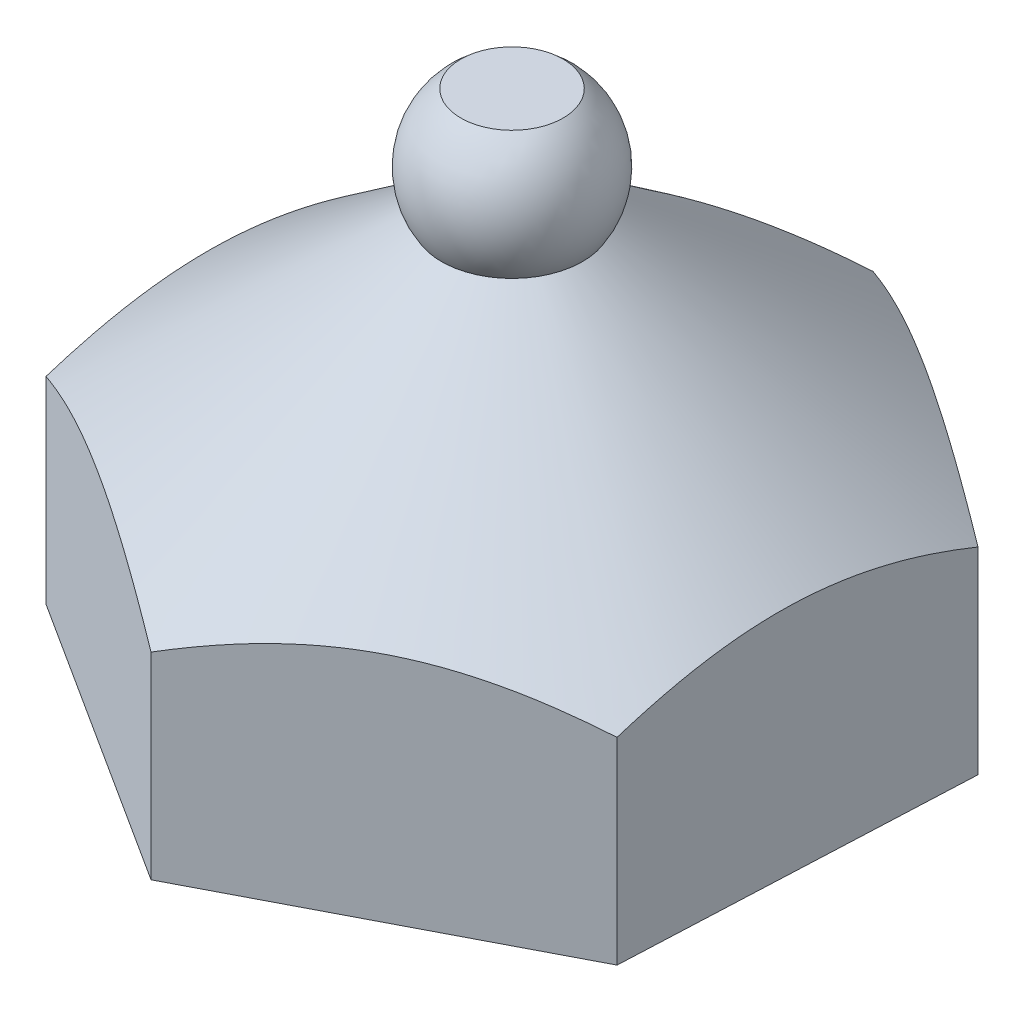
ISO-10303-21;
HEADER;
FILE_DESCRIPTION(('STEP AP214'),'2;1');
FILE_NAME('part.step','',(''),(''),'','','');
FILE_SCHEMA(('AUTOMOTIVE_DESIGN { 1 0 10303 214 1 1 1 1 }'));
ENDSEC;
DATA;
#1=APPLICATION_CONTEXT('core data for automotive mechanical design processes');
#2=APPLICATION_PROTOCOL_DEFINITION('international standard','automotive_design',2000,#1);
#3=PRODUCT_CONTEXT('',#1,'mechanical');
#4=PRODUCT('Part','Part','',(#3));
#5=PRODUCT_RELATED_PRODUCT_CATEGORY('part','',(#4));
#6=PRODUCT_DEFINITION_FORMATION('','',#4);
#7=PRODUCT_DEFINITION_CONTEXT('part definition',#1,'design');
#8=PRODUCT_DEFINITION('design','',#6,#7);
#9=PRODUCT_DEFINITION_SHAPE('','',#8);
#10=(LENGTH_UNIT() NAMED_UNIT(*) SI_UNIT(.MILLI.,.METRE.));
#11=(NAMED_UNIT(*) PLANE_ANGLE_UNIT() SI_UNIT($,.RADIAN.));
#12=(NAMED_UNIT(*) SI_UNIT($,.STERADIAN.) SOLID_ANGLE_UNIT());
#13=UNCERTAINTY_MEASURE_WITH_UNIT(LENGTH_MEASURE(1.E-05),#10,'distance_accuracy_value','');
#14=(GEOMETRIC_REPRESENTATION_CONTEXT(3) GLOBAL_UNCERTAINTY_ASSIGNED_CONTEXT((#13)) GLOBAL_UNIT_ASSIGNED_CONTEXT((#10,
#11,#12)) REPRESENTATION_CONTEXT('',''));
#15=CARTESIAN_POINT('',(0.,0.,0.));
#16=DIRECTION('',(0.,0.,1.));
#17=DIRECTION('',(1.,0.,0.));
#18=AXIS2_PLACEMENT_3D('',#15,#16,#17);
#19=CARTESIAN_POINT('',(0.,51.1495004086117,0.));
#20=DIRECTION('',(0.,-1.,0.));
#21=DIRECTION('',(1.,0.,0.));
#22=AXIS2_PLACEMENT_3D('',#19,#20,#21);
#23=CONICAL_SURFACE('',#22,7.16037048369406,0.921945158520944);
#24=CARTESIAN_POINT('',(0.,51.1495004086117,0.));
#25=DIRECTION('',(0.,1.,0.));
#26=DIRECTION('',(-1.,0.,0.));
#27=AXIS2_PLACEMENT_3D('',#24,#25,#26);
#28=CIRCLE('',#27,7.16037048369406);
#29=CARTESIAN_POINT('',(-7.16037048369406,51.1495004086117,0.));
#30=VERTEX_POINT('',#29);
#31=EDGE_CURVE('E302',#30,#30,#28,.T.);
#32=ORIENTED_EDGE('',*,*,#31,.F.);
#33=EDGE_LOOP('',(#32));
#34=FACE_BOUND('',#33,.T.);
#35=CARTESIAN_POINT('',(1.58385366244929,29.9999145693291,-35.0119251757061));
#36=CARTESIAN_POINT('',(1.01537716760496,30.2427167814775,-34.7171269933952));
#37=CARTESIAN_POINT('',(0.443914783763107,30.4768628882811,-34.4207804011552));
#38=CARTESIAN_POINT('',(-0.705264800507123,30.9254923805729,-33.8248436198386));
#39=CARTESIAN_POINT('',(-1.28298404109508,31.1399691226313,-33.5252523727845));
#40=CARTESIAN_POINT('',(-2.446339868959,31.5473597098329,-32.9219641338767));
#41=CARTESIAN_POINT('',(-3.03199515825695,31.7402061651367,-32.6182574436061));
#42=CARTESIAN_POINT('',(-4.20930541908518,32.1009203685606,-32.0077327727432));
#43=CARTESIAN_POINT('',(-4.80095982843211,32.2687904345519,-31.7009150836856));
#44=CARTESIAN_POINT('',(-5.98429112206433,32.5754364911181,-31.08726805061));
#45=CARTESIAN_POINT('',(-6.57591435867293,32.714473811026,-30.7804665269817));
#46=CARTESIAN_POINT('',(-7.76407653811296,32.9629489971312,-30.1643143131854));
#47=CARTESIAN_POINT('',(-8.36061554822249,33.0723864575242,-29.8549635881286));
#48=CARTESIAN_POINT('',(-9.55692242627263,33.2593444929095,-29.2345877303162));
#49=CARTESIAN_POINT('',(-10.1566855968336,33.3369029640056,-28.9235650335083));
#50=CARTESIAN_POINT('',(-11.3588907297725,33.4585855617172,-28.3001304831453));
#51=CARTESIAN_POINT('',(-11.9613326671131,33.5027100001689,-27.9877186425739));
#52=CARTESIAN_POINT('',(-13.176006628547,33.5568766863673,-27.3578180588582));
#53=CARTESIAN_POINT('',(-13.7882561513357,33.5664258567427,-27.0403202413129));
#54=CARTESIAN_POINT('',(-15.0123744915989,33.5498368172297,-26.405522030805));
#55=CARTESIAN_POINT('',(-15.6242433064035,33.5236983598387,-26.0882216392267));
#56=CARTESIAN_POINT('',(-16.8463190536261,33.4363498253804,-25.4544826681438));
#57=CARTESIAN_POINT('',(-17.4565249261411,33.3751210581077,-25.1380446382792));
#58=CARTESIAN_POINT('',(-18.6735111871933,33.2190137836656,-24.5069449518202));
#59=CARTESIAN_POINT('',(-19.2802915647791,33.124135168978,-24.192283300905));
#60=CARTESIAN_POINT('',(-20.4891111047535,32.9028158684595,-23.565418678782));
#61=CARTESIAN_POINT('',(-21.0911514986381,32.7763836798071,-23.2532150689502));
#62=CARTESIAN_POINT('',(-22.2897882186717,32.4944256033619,-22.6316310113476));
#63=CARTESIAN_POINT('',(-22.8863844261892,32.3388990831691,-22.3222506250963));
#64=CARTESIAN_POINT('',(-24.6668394171144,31.8327875840299,-21.39894966231));
#65=CARTESIAN_POINT('',(-25.8419583932941,31.4425570290747,-20.7895613387493));
#66=CARTESIAN_POINT('',(-27.4288570959712,30.8523093709209,-19.9666339929338));
#67=CARTESIAN_POINT('',(-27.851786194475,30.6887458846854,-19.7473131755983));
#68=CARTESIAN_POINT('',(-28.6934838068188,30.3516450164405,-19.3108291196615));
#69=CARTESIAN_POINT('',(-29.1122592884377,30.1781297320462,-19.0936622677383));
#70=CARTESIAN_POINT('',(-29.5294999863646,29.9999145693292,-18.877291317575));
#71=B_SPLINE_CURVE_WITH_KNOTS('',3,(#35,#36,#37,#38,#39,#40,#41,#42,#43,#44,#45,#46,#47,#48,#49,
#50,#51,#52,#53,#54,#55,#56,#57,#58,#59,#60,#61,#62,#63,#64,#65,#66,#67,#68,#69,#70),
.UNSPECIFIED.,.F.,.F.,(4,2,2,2,2,2,2,2,2,2,2,2,2,2,2,2,2,4),(0.,2.05461119188761,
4.10991380305936,6.17145163767639,8.23279803695389,10.2745548106162,12.3163395746676,
14.3556901009399,16.3950216061541,18.4633239123409,20.531640562803,22.6010598891452,
24.6704858277667,26.7393550832309,28.8082693132584,32.9440682321943,34.4551463727565,
35.9629901799976),.UNSPECIFIED.);
#72=CARTESIAN_POINT('',(1.58365366244929,30.,-35.0118214605358));
#73=VERTEX_POINT('',#72);
#74=CARTESIAN_POINT('',(-29.5292999863646,30.,-18.8773950327453));
#75=VERTEX_POINT('',#74);
#76=EDGE_CURVE('E185',#73,#75,#71,.T.);
#77=ORIENTED_EDGE('',*,*,#76,.T.);
#78=CARTESIAN_POINT('',(-29.5292909399706,29.9999240828108,-18.8775950327453));
#79=CARTESIAN_POINT('',(-29.558226461552,30.2427259423472,-18.237881098128));
#80=CARTESIAN_POINT('',(-29.5873139652319,30.4768716911145,-17.5948071042863));
#81=CARTESIAN_POINT('',(-29.6458073433867,30.9255004578123,-16.301620493389));
#82=CARTESIAN_POINT('',(-29.6752133217058,31.1399768323096,-15.6515055805163));
#83=CARTESIAN_POINT('',(-29.7344282718238,31.547366673961,-14.3423662715349));
#84=CARTESIAN_POINT('',(-29.764238195555,31.740212751398,-13.6833208298599));
#85=CARTESIAN_POINT('',(-29.8241634272093,32.1009261944042,-12.3584784344483));
#86=CARTESIAN_POINT('',(-29.8542787065172,32.2687958778461,-11.6926821133435));
#87=CARTESIAN_POINT('',(-29.9145104089395,32.5754411742644,-10.3610641835675));
#88=CARTESIAN_POINT('',(-29.9446241013882,32.7144781163018,-9.6953029451544));
#89=CARTESIAN_POINT('',(-30.0051016957235,32.9629525518033,-8.35824877388044));
#90=CARTESIAN_POINT('',(-30.0354656010346,33.0723896394626,-7.68695576531067));
#91=CARTESIAN_POINT('',(-30.0963577602523,33.2593469424978,-6.34073628725948));
#92=CARTESIAN_POINT('',(-30.1268857750628,33.336905053917,-5.66581510377518));
#93=CARTESIAN_POINT('',(-30.1880781547536,33.4585869530852,-4.31295827448085));
#94=CARTESIAN_POINT('',(-30.2187425183596,33.5027110526699,-3.63502265684544));
#95=CARTESIAN_POINT('',(-30.28056955968,33.5568770844072,-2.26813456542058));
#96=CARTESIAN_POINT('',(-30.311733128066,33.5664259415225,-1.57916240043661));
#97=CARTESIAN_POINT('',(-30.3740408862093,33.549836317488,-0.201646498162144));
#98=CARTESIAN_POINT('',(-30.4051850758307,33.5236975888344,0.486897236123928));
#99=CARTESIAN_POINT('',(-30.4673888645447,33.4363485594675,1.86211455558135));
#100=CARTESIAN_POINT('',(-30.4984484096877,33.3751195685526,2.54878694802264));
#101=CARTESIAN_POINT('',(-30.5603931420789,33.2190118975846,3.91827698383518));
#102=CARTESIAN_POINT('',(-30.5912783287697,33.124133110015,4.60109461488276));
#103=CARTESIAN_POINT('',(-30.6528073732508,32.9028135158119,5.96139451573118));
#104=CARTESIAN_POINT('',(-30.6834512937268,32.7763812066698,6.63887817140442));
#105=CARTESIAN_POINT('',(-30.7444620309838,32.4944229383964,7.98771920317013));
#106=CARTESIAN_POINT('',(-30.7748288417264,32.3388963468643,8.65907644576457));
#107=CARTESIAN_POINT('',(-30.8654541910996,31.8327847022191,10.6626449199148));
#108=CARTESIAN_POINT('',(-30.9252678727011,31.4425541410969,11.985021138139));
#109=CARTESIAN_POINT('',(-31.0060409424562,30.8523083570654,13.7707728868589));
#110=CARTESIAN_POINT('',(-31.0275678365489,30.6887468167939,14.2466949842502));
#111=CARTESIAN_POINT('',(-31.0704098553536,30.3516500724215,15.1938573272327));
#112=CARTESIAN_POINT('',(-31.0917253347143,30.1781369651845,15.665105413489));
#113=CARTESIAN_POINT('',(-31.1129626952079,29.9999240828108,16.1346264277906));
#114=B_SPLINE_CURVE_WITH_KNOTS('',3,(#78,#79,#80,#81,#82,#83,#84,#85,#86,#87,#88,#89,#90,#91,
#92,#93,#94,#95,#96,#97,#98,#99,#100,#101,#102,#103,#104,#105,#106,#107,#108,#109,#110,#111,
#112,#113),.UNSPECIFIED.,.F.,.F.,(4,2,2,2,2,2,2,2,2,2,2,2,2,2,2,2,2,4),(0.,2.05461013575421,
4.10991169046379,6.17144845188154,8.23279377796118,10.2745495092814,12.3163332310235,
14.3556827191538,16.3950131862561,18.4633143279125,20.5316298139177,22.6010479764594,
24.6704727511868,26.7393408216596,28.8082538668057,32.9440504104238,34.455110597358,
35.9629365241517),.UNSPECIFIED.);
#115=CARTESIAN_POINT('',(-31.1129536488139,30.,16.1344264277906));
#116=VERTEX_POINT('',#115);
#117=EDGE_CURVE('E192',#75,#116,#114,.T.);
#118=ORIENTED_EDGE('',*,*,#117,.T.);
#119=CARTESIAN_POINT('',(-31.1131536488139,29.9999099876668,16.1342985724399));
#120=CARTESIAN_POINT('',(-30.5736125880104,30.2427123696318,16.4792146302495));
#121=CARTESIAN_POINT('',(-30.0312376197791,30.4768586488643,16.8259423391996));
#122=CARTESIAN_POINT('',(-28.9405512356247,30.9254884905995,17.5231927901086));
#123=CARTESIAN_POINT('',(-28.3922378833858,31.1399654096741,17.8737167699091));
#124=CARTESIAN_POINT('',(-27.2880968211783,31.54735635593,18.5795684837252));
#125=CARTESIAN_POINT('',(-26.7322513610954,31.740202993213,18.9349075649763));
#126=CARTESIAN_POINT('',(-25.6148661391617,32.1009175628514,19.6492259622269));
#127=CARTESIAN_POINT('',(-25.0533269108793,32.2687878130771,20.0082049371287));
#128=CARTESIAN_POINT('',(-23.9302271218176,32.5754342357278,20.7261765243014));
#129=CARTESIAN_POINT('',(-23.368717478117,32.7144717376169,21.0851365864677));
#130=CARTESIAN_POINT('',(-22.2410326884126,32.9629472852101,21.8060392579668));
#131=CARTESIAN_POINT('',(-21.6748574785552,33.0723849251104,22.1679819081197));
#132=CARTESIAN_POINT('',(-20.5394425438855,33.2593433131931,22.8938262815975));
#133=CARTESIAN_POINT('',(-19.9702072773665,33.3369019575083,23.257725154839));
#134=CARTESIAN_POINT('',(-18.8291942961518,33.4585848916362,23.9871482293387));
#135=CARTESIAN_POINT('',(-18.2574166052192,33.502709493285,24.3526724154058));
#136=CARTESIAN_POINT('',(-17.1045694294259,33.5568764946699,25.0896608153978));
#137=CARTESIAN_POINT('',(-16.5234833364257,33.5664258159103,25.4611356465203));
#138=CARTESIAN_POINT('',(-15.3616724717224,33.5498370579011,26.2038543244593));
#139=CARTESIAN_POINT('',(-14.7809477025532,33.5236987311492,26.5750981696561));
#140=CARTESIAN_POINT('',(-13.6210754522057,33.4363504350374,27.3165775365033));
#141=CARTESIAN_POINT('',(-13.0419289769782,33.3751217754701,27.6868124150727));
#142=CARTESIAN_POINT('',(-11.8868871503359,33.2190146919937,28.4252038043348));
#143=CARTESIAN_POINT('',(-11.3109918093152,33.1241361605656,28.7933603083828));
#144=CARTESIAN_POINT('',(-10.1637010104706,32.9028170014848,29.5267966457571));
#145=CARTESIAN_POINT('',(-9.59230438385596,32.7763848708599,29.892077226264));
#146=CARTESIAN_POINT('',(-8.45467809553655,32.4944268867986,30.6193352667241));
#147=CARTESIAN_POINT('',(-7.88844854642484,32.3389004009627,30.9813126546991));
#148=CARTESIAN_POINT('',(-6.19861845019045,31.8327889718988,32.0615817528344));
#149=CARTESIAN_POINT('',(-5.0833128562404,31.4425584199138,32.7745706922589));
#150=CARTESIAN_POINT('',(-3.57718487210541,30.8523098591899,33.7374033005333));
#151=CARTESIAN_POINT('',(-3.17578062666791,30.688745435785,33.9940117034566));
#152=CARTESIAN_POINT('',(-2.37692099062936,30.3516425814969,34.5047040982028));
#153=CARTESIAN_POINT('',(-1.97945898680088,30.1781262485904,34.7587923177082));
#154=CARTESIAN_POINT('',(-1.58345366244927,29.9999099876668,35.0119493158866));
#155=B_SPLINE_CURVE_WITH_KNOTS('',3,(#119,#120,#121,#122,#123,#124,#125,#126,#127,#128,#129,
#130,#131,#132,#133,#134,#135,#136,#137,#138,#139,#140,#141,#142,#143,#144,#145,#146,#147,#148,
#149,#150,#151,#152,#153,#154),.UNSPECIFIED.,.F.,.F.,(4,2,2,2,2,2,2,2,2,2,2,2,2,2,2,2,2,4),(0.,
2.05461170051774,4.10991482047797,6.171453171944,8.2328000880698,10.2745573637204,
12.3163426297445,14.3556936559823,16.3950256611475,18.4633285281683,20.5316457394288,
22.6010656262534,24.6704921254022,26.7393619515542,28.8082767522165,32.9440768150973,
34.4551636020629,35.9630160204637),.UNSPECIFIED.);
#156=CARTESIAN_POINT('',(-1.58365366244926,30.,35.0118214605359));
#157=VERTEX_POINT('',#156);
#158=EDGE_CURVE('E153',#116,#157,#155,.T.);
#159=ORIENTED_EDGE('',*,*,#158,.T.);
#160=CARTESIAN_POINT('',(-1.58385366244927,29.9999145693291,35.0119251757061));
#161=CARTESIAN_POINT('',(-1.01537716760494,30.2427167814775,34.7171269933952));
#162=CARTESIAN_POINT('',(-0.443914783763091,30.4768628882811,34.4207804011552));
#163=CARTESIAN_POINT('',(0.705264800507141,30.9254923805729,33.8248436198386));
#164=CARTESIAN_POINT('',(1.2829840410951,31.1399691226313,33.5252523727845));
#165=CARTESIAN_POINT('',(2.44633986895902,31.5473597098329,32.9219641338767));
#166=CARTESIAN_POINT('',(3.03199515825697,31.7402061651367,32.6182574436061));
#167=CARTESIAN_POINT('',(4.20930541908521,32.1009203685606,32.0077327727432));
#168=CARTESIAN_POINT('',(4.80095982843213,32.2687904345519,31.7009150836856));
#169=CARTESIAN_POINT('',(5.98429112206435,32.5754364911181,31.08726805061));
#170=CARTESIAN_POINT('',(6.57591435867296,32.714473811026,30.7804665269817));
#171=CARTESIAN_POINT('',(7.76407653811299,32.9629489971312,30.1643143131854));
#172=CARTESIAN_POINT('',(8.36061554822251,33.0723864575242,29.8549635881286));
#173=CARTESIAN_POINT('',(9.55692242627265,33.2593444929095,29.2345877303162));
#174=CARTESIAN_POINT('',(10.1566855968336,33.3369029640056,28.9235650335083));
#175=CARTESIAN_POINT('',(11.3588907297725,33.4585855617172,28.3001304831453));
#176=CARTESIAN_POINT('',(11.9613326671131,33.5027100001689,27.9877186425739));
#177=CARTESIAN_POINT('',(13.176006628547,33.5568766863673,27.3578180588582));
#178=CARTESIAN_POINT('',(13.7882561513357,33.5664258567427,27.0403202413129));
#179=CARTESIAN_POINT('',(15.0123744915989,33.5498368172297,26.4055220308049));
#180=CARTESIAN_POINT('',(15.6242433064035,33.5236983598387,26.0882216392267));
#181=CARTESIAN_POINT('',(16.8463190536261,33.4363498253804,25.4544826681438));
#182=CARTESIAN_POINT('',(17.4565249261411,33.3751210581077,25.1380446382792));
#183=CARTESIAN_POINT('',(18.6735111871934,33.2190137836656,24.5069449518202));
#184=CARTESIAN_POINT('',(19.2802915647791,33.124135168978,24.192283300905));
#185=CARTESIAN_POINT('',(20.4891111047535,32.9028158684595,23.565418678782));
#186=CARTESIAN_POINT('',(21.0911514986381,32.7763836798071,23.2532150689502));
#187=CARTESIAN_POINT('',(22.2897882186717,32.4944256033619,22.6316310113476));
#188=CARTESIAN_POINT('',(22.8863844261892,32.3388990831691,22.3222506250963));
#189=CARTESIAN_POINT('',(24.6668394171144,31.8327875840298,21.39894966231));
#190=CARTESIAN_POINT('',(25.8419583932941,31.4425570290747,20.7895613387493));
#191=CARTESIAN_POINT('',(27.4288570959712,30.8523093709209,19.9666339929338));
#192=CARTESIAN_POINT('',(27.851786194475,30.6887458846853,19.7473131755983));
#193=CARTESIAN_POINT('',(28.6934838068188,30.3516450164405,19.3108291196615));
#194=CARTESIAN_POINT('',(29.1122592884377,30.1781297320462,19.0936622677383));
#195=CARTESIAN_POINT('',(29.5294999863646,29.9999145693291,18.877291317575));
#196=B_SPLINE_CURVE_WITH_KNOTS('',3,(#160,#161,#162,#163,#164,#165,#166,#167,#168,#169,#170,
#171,#172,#173,#174,#175,#176,#177,#178,#179,#180,#181,#182,#183,#184,#185,#186,#187,#188,#189,
#190,#191,#192,#193,#194,#195),.UNSPECIFIED.,.F.,.F.,(4,2,2,2,2,2,2,2,2,2,2,2,2,2,2,2,2,4),(0.,
2.05461119188761,4.10991380305936,6.1714516376764,8.2327980369539,10.2745548106162,
12.3163395746677,14.3556901009399,16.3950216061541,18.4633239123409,20.531640562803,
22.6010598891452,24.6704858277667,26.7393550832309,28.8082693132584,32.9440682321943,
34.4551463727565,35.9629901799976),.UNSPECIFIED.);
#197=CARTESIAN_POINT('',(29.5292999863646,30.,18.8773950327453));
#198=VERTEX_POINT('',#197);
#199=EDGE_CURVE('E104',#157,#198,#196,.T.);
#200=ORIENTED_EDGE('',*,*,#199,.T.);
#201=CARTESIAN_POINT('',(29.5292909399706,29.9999240828108,18.8775950327453));
#202=CARTESIAN_POINT('',(29.558226461552,30.2427259423472,18.237881098128));
#203=CARTESIAN_POINT('',(29.5873139652319,30.4768716911145,17.5948071042863));
#204=CARTESIAN_POINT('',(29.6458073433867,30.9255004578123,16.301620493389));
#205=CARTESIAN_POINT('',(29.6752133217058,31.1399768323096,15.6515055805163));
#206=CARTESIAN_POINT('',(29.7344282718238,31.547366673961,14.3423662715349));
#207=CARTESIAN_POINT('',(29.764238195555,31.740212751398,13.6833208298599));
#208=CARTESIAN_POINT('',(29.8241634272093,32.1009261944042,12.3584784344483));
#209=CARTESIAN_POINT('',(29.8542787065172,32.2687958778461,11.6926821133435));
#210=CARTESIAN_POINT('',(29.9145104089395,32.5754411742644,10.3610641835675));
#211=CARTESIAN_POINT('',(29.9446241013882,32.7144781163018,9.6953029451544));
#212=CARTESIAN_POINT('',(30.0051016957235,32.9629525518033,8.35824877388043));
#213=CARTESIAN_POINT('',(30.0354656010346,33.0723896394626,7.68695576531067));
#214=CARTESIAN_POINT('',(30.0963577602523,33.2593469424978,6.34073628725947));
#215=CARTESIAN_POINT('',(30.1268857750628,33.336905053917,5.66581510377518));
#216=CARTESIAN_POINT('',(30.1880781547537,33.4585869530852,4.31295827448084));
#217=CARTESIAN_POINT('',(30.2187425183596,33.5027110526699,3.63502265684544));
#218=CARTESIAN_POINT('',(30.28056955968,33.5568770844072,2.26813456542057));
#219=CARTESIAN_POINT('',(30.311733128066,33.5664259415224,1.57916240043661));
#220=CARTESIAN_POINT('',(30.3740408862093,33.549836317488,0.201646498162139));
#221=CARTESIAN_POINT('',(30.4051850758307,33.5236975888344,-0.486897236123933));
#222=CARTESIAN_POINT('',(30.4673888645447,33.4363485594675,-1.86211455558136));
#223=CARTESIAN_POINT('',(30.4984484096877,33.3751195685526,-2.54878694802264));
#224=CARTESIAN_POINT('',(30.5603931420789,33.2190118975846,-3.91827698383518));
#225=CARTESIAN_POINT('',(30.5912783287697,33.124133110015,-4.60109461488276));
#226=CARTESIAN_POINT('',(30.6528073732508,32.9028135158119,-5.96139451573118));
#227=CARTESIAN_POINT('',(30.6834512937268,32.7763812066698,-6.63887817140442));
#228=CARTESIAN_POINT('',(30.7444620309838,32.4944229383964,-7.98771920317013));
#229=CARTESIAN_POINT('',(30.7748288417264,32.3388963468643,-8.65907644576457));
#230=CARTESIAN_POINT('',(30.8654541910997,31.8327847022191,-10.6626449199148));
#231=CARTESIAN_POINT('',(30.9252678727011,31.4425541410968,-11.985021138139));
#232=CARTESIAN_POINT('',(31.0060409424562,30.8523083570654,-13.7707728868589));
#233=CARTESIAN_POINT('',(31.0275678365489,30.6887468167939,-14.2466949842502));
#234=CARTESIAN_POINT('',(31.0704098553536,30.3516500724215,-15.1938573272327));
#235=CARTESIAN_POINT('',(31.0917253347143,30.1781369651845,-15.665105413489));
#236=CARTESIAN_POINT('',(31.1129626952079,29.9999240828108,-16.1346264277906));
#237=B_SPLINE_CURVE_WITH_KNOTS('',3,(#201,#202,#203,#204,#205,#206,#207,#208,#209,#210,#211,
#212,#213,#214,#215,#216,#217,#218,#219,#220,#221,#222,#223,#224,#225,#226,#227,#228,#229,#230,
#231,#232,#233,#234,#235,#236),.UNSPECIFIED.,.F.,.F.,(4,2,2,2,2,2,2,2,2,2,2,2,2,2,2,2,2,4),(0.,
2.05461013575421,4.10991169046379,6.17144845188154,8.23279377796118,10.2745495092814,
12.3163332310235,14.3556827191538,16.3950131862561,18.4633143279125,20.5316298139177,
22.6010479764594,24.6704727511868,26.7393408216596,28.8082538668057,32.9440504104238,
34.455110597358,35.9629365241517),.UNSPECIFIED.);
#238=CARTESIAN_POINT('',(31.1129536488139,30.,-16.1344264277906));
#239=VERTEX_POINT('',#238);
#240=EDGE_CURVE('E171',#198,#239,#237,.T.);
#241=ORIENTED_EDGE('',*,*,#240,.T.);
#242=CARTESIAN_POINT('',(31.1131536488139,29.9999099876668,-16.1342985724398));
#243=CARTESIAN_POINT('',(30.5736125880104,30.2427123696318,-16.4792146302494));
#244=CARTESIAN_POINT('',(30.0312376197791,30.4768586488643,-16.8259423391996));
#245=CARTESIAN_POINT('',(28.9405512356247,30.9254884905995,-17.5231927901086));
#246=CARTESIAN_POINT('',(28.3922378833858,31.1399654096741,-17.8737167699091));
#247=CARTESIAN_POINT('',(27.2880968211783,31.54735635593,-18.5795684837252));
#248=CARTESIAN_POINT('',(26.7322513610954,31.740202993213,-18.9349075649763));
#249=CARTESIAN_POINT('',(25.6148661391617,32.1009175628514,-19.6492259622269));
#250=CARTESIAN_POINT('',(25.0533269108793,32.2687878130771,-20.0082049371286));
#251=CARTESIAN_POINT('',(23.9302271218176,32.5754342357278,-20.7261765243014));
#252=CARTESIAN_POINT('',(23.368717478117,32.7144717376169,-21.0851365864677));
#253=CARTESIAN_POINT('',(22.2410326884126,32.9629472852102,-21.8060392579668));
#254=CARTESIAN_POINT('',(21.6748574785552,33.0723849251104,-22.1679819081197));
#255=CARTESIAN_POINT('',(20.5394425438855,33.2593433131931,-22.8938262815974));
#256=CARTESIAN_POINT('',(19.9702072773665,33.3369019575083,-23.257725154839));
#257=CARTESIAN_POINT('',(18.8291942961518,33.4585848916362,-23.9871482293387));
#258=CARTESIAN_POINT('',(18.2574166052192,33.502709493285,-24.3526724154058));
#259=CARTESIAN_POINT('',(17.1045694294259,33.5568764946699,-25.0896608153978));
#260=CARTESIAN_POINT('',(16.5234833364257,33.5664258159103,-25.4611356465202));
#261=CARTESIAN_POINT('',(15.3616724717224,33.5498370579011,-26.2038543244593));
#262=CARTESIAN_POINT('',(14.7809477025532,33.5236987311492,-26.5750981696561));
#263=CARTESIAN_POINT('',(13.6210754522057,33.4363504350374,-27.3165775365033));
#264=CARTESIAN_POINT('',(13.0419289769782,33.3751217754701,-27.6868124150727));
#265=CARTESIAN_POINT('',(11.8868871503359,33.2190146919937,-28.4252038043348));
#266=CARTESIAN_POINT('',(11.3109918093152,33.1241361605656,-28.7933603083828));
#267=CARTESIAN_POINT('',(10.1637010104706,32.9028170014848,-29.5267966457571));
#268=CARTESIAN_POINT('',(9.59230438385596,32.7763848708599,-29.892077226264));
#269=CARTESIAN_POINT('',(8.45467809553655,32.4944268867986,-30.6193352667241));
#270=CARTESIAN_POINT('',(7.88844854642484,32.3389004009627,-30.9813126546991));
#271=CARTESIAN_POINT('',(6.19861845019045,31.8327889718988,-32.0615817528344));
#272=CARTESIAN_POINT('',(5.0833128562404,31.4425584199138,-32.7745706922589));
#273=CARTESIAN_POINT('',(3.57718487210541,30.8523098591899,-33.7374033005333));
#274=CARTESIAN_POINT('',(3.17578062666791,30.688745435785,-33.9940117034566));
#275=CARTESIAN_POINT('',(2.37692099062937,30.3516425814969,-34.5047040982028));
#276=CARTESIAN_POINT('',(1.9794589868009,30.1781262485904,-34.7587923177082));
#277=CARTESIAN_POINT('',(1.58345366244928,29.9999099876668,-35.0119493158866));
#278=B_SPLINE_CURVE_WITH_KNOTS('',3,(#242,#243,#244,#245,#246,#247,#248,#249,#250,#251,#252,
#253,#254,#255,#256,#257,#258,#259,#260,#261,#262,#263,#264,#265,#266,#267,#268,#269,#270,#271,
#272,#273,#274,#275,#276,#277),.UNSPECIFIED.,.F.,.F.,(4,2,2,2,2,2,2,2,2,2,2,2,2,2,2,2,2,4),(0.,
2.05461170051775,4.10991482047798,6.171453171944,8.2328000880698,10.2745573637204,
12.3163426297445,14.3556936559823,16.3950256611476,18.4633285281683,20.5316457394288,
22.6010656262534,24.6704921254022,26.7393619515542,28.8082767522166,32.9440768150973,
34.4551636020629,35.9630160204636),.UNSPECIFIED.);
#279=EDGE_CURVE('E178',#239,#73,#278,.T.);
#280=ORIENTED_EDGE('',*,*,#279,.T.);
#281=EDGE_LOOP('',(#77,#118,#159,#200,#241,#280));
#282=FACE_BOUND('',#281,.T.);
#283=ADVANCED_FACE('F40',(#34,#282),#23,.T.);
#284=CARTESIAN_POINT('',(0.,62.7619047619047,0.));
#285=DIRECTION('',(0.,1.,0.));
#286=DIRECTION('',(-1.,0.,0.));
#287=AXIS2_PLACEMENT_3D('',#284,#285,#286);
#288=PLANE('',#287);
#289=CARTESIAN_POINT('',(0.,62.7619047619047,0.));
#290=DIRECTION('',(0.,1.,0.));
#291=DIRECTION('',(-1.,0.,0.));
#292=AXIS2_PLACEMENT_3D('',#289,#290,#291);
#293=CIRCLE('',#292,5.18295371359426);
#294=CARTESIAN_POINT('',(-5.18295371359427,62.7619047619047,0.));
#295=VERTEX_POINT('',#294);
#296=EDGE_CURVE('E97',#295,#295,#293,.T.);
#297=ORIENTED_EDGE('',*,*,#296,.T.);
#298=EDGE_LOOP('',(#297));
#299=FACE_BOUND('',#298,.T.);
#300=ADVANCED_FACE('F137',(#299),#288,.T.);
#301=CARTESIAN_POINT('',(0.,55.9047619047619,0.));
#302=DIRECTION('',(0.,1.,0.));
#303=DIRECTION('',(-1.,0.,0.));
#304=AXIS2_PLACEMENT_3D('',#301,#302,#303);
#305=SPHERICAL_SURFACE('',#304,8.59554636777243);
#306=CARTESIAN_POINT('',(-7.16037048369406,51.1495004086117,0.));
#307=CARTESIAN_POINT('',(-7.23515870171463,51.2621102957263,0.));
#308=CARTESIAN_POINT('',(-7.30728608173669,51.3764870174552,0.));
#309=CARTESIAN_POINT('',(-7.44606824256999,51.6085138234563,0.));
#310=CARTESIAN_POINT('',(-7.51272302338122,51.7261639077286,0.));
#311=CARTESIAN_POINT('',(-7.64040906257903,51.9644771321312,0.));
#312=CARTESIAN_POINT('',(-7.7014403209656,52.0851402722616,0.));
#313=CARTESIAN_POINT('',(-7.81774417163848,52.3292106436361,0.));
#314=CARTESIAN_POINT('',(-7.87301676392479,52.4526178748803,0.));
#315=CARTESIAN_POINT('',(-7.97768008093003,52.7019018794522,0.));
#316=CARTESIAN_POINT('',(-8.02707080564896,52.8277786527799,0.));
#317=CARTESIAN_POINT('',(-8.11986051126576,53.0817215560333,0.));
#318=CARTESIAN_POINT('',(-8.16325949216363,53.2097876859589,0.));
#319=CARTESIAN_POINT('',(-8.24396910653961,53.4678242817657,0.));
#320=CARTESIAN_POINT('',(-8.28127974001772,53.597794747647,0.));
#321=CARTESIAN_POINT('',(-8.34972962322346,53.8593507463017,0.));
#322=CARTESIAN_POINT('',(-8.38086887295107,53.9909362790752,0.));
#323=CARTESIAN_POINT('',(-8.43690668307062,54.2554295505965,0.));
#324=CARTESIAN_POINT('',(-8.46180524346254,54.3883372893443,0.));
#325=CARTESIAN_POINT('',(-8.5053062600357,54.6551791684247,0.));
#326=CARTESIAN_POINT('',(-8.52390871621692,54.7891133087572,0.));
#327=CARTESIAN_POINT('',(-8.55477612200566,55.0577099024149,0.));
#328=CARTESIAN_POINT('',(-8.56704107161318,55.19237235574,0.));
#329=CARTESIAN_POINT('',(-8.58520616696049,55.4621258657792,0.));
#330=CARTESIAN_POINT('',(-8.59110631270028,55.5972169224933,0.));
#331=CARTESIAN_POINT('',(-8.59652866873096,55.8675269758055,0.));
#332=CARTESIAN_POINT('',(-8.59605087902184,56.0027459724037,0.));
#333=CARTESIAN_POINT('',(-8.58871842754196,56.2730109572282,0.));
#334=CARTESIAN_POINT('',(-8.58186376577119,56.4080569454544,0.));
#335=CARTESIAN_POINT('',(-8.56179282614907,56.6776753503333,0.));
#336=CARTESIAN_POINT('',(-8.54857654829772,56.812247766986,0.));
#337=CARTESIAN_POINT('',(-8.5158117911372,57.0806195195142,0.));
#338=CARTESIAN_POINT('',(-8.49626331182804,57.2144188553895,0.));
#339=CARTESIAN_POINT('',(-8.4508776595495,57.4809466577555,0.));
#340=CARTESIAN_POINT('',(-8.42504048658013,57.6136751242461,0.));
#341=CARTESIAN_POINT('',(-8.36713495112135,57.8777657826005,0.));
#342=CARTESIAN_POINT('',(-8.33506658863193,58.0091279744642,0.));
#343=CARTESIAN_POINT('',(-8.2647700466323,58.2701937191525,0.));
#344=CARTESIAN_POINT('',(-8.22654186712209,58.3998972719771,0.));
#345=CARTESIAN_POINT('',(-8.14401077309046,58.6573570657019,0.));
#346=CARTESIAN_POINT('',(-8.09970785856904,58.785113306602,0.));
#347=CARTESIAN_POINT('',(-8.00512589667173,59.0383941375985,0.));
#348=CARTESIAN_POINT('',(-7.95484684929585,59.1639187276948,0.));
#349=CARTESIAN_POINT('',(-7.84842452454696,59.412456885052,0.));
#350=CARTESIAN_POINT('',(-7.79228124717396,59.5354704523128,0.));
#351=CARTESIAN_POINT('',(-7.6742554169117,59.778712780569,0.));
#352=CARTESIAN_POINT('',(-7.61237286402245,59.8989415415645,0.));
#353=CARTESIAN_POINT('',(-7.483006210811,60.1363466719027,0.));
#354=CARTESIAN_POINT('',(-7.4155221104888,60.2535230412454,0.));
#355=CARTESIAN_POINT('',(-7.27510255725853,60.4845625961135,0.));
#356=CARTESIAN_POINT('',(-7.20216710435047,60.5984257816389,0.));
#357=CARTESIAN_POINT('',(-7.05100717442237,60.82258555173,0.));
#358=CARTESIAN_POINT('',(-6.97278269740233,60.9328821362957,0.));
#359=CARTESIAN_POINT('',(-6.81121881580482,61.1496632212443,0.));
#360=CARTESIAN_POINT('',(-6.72787941122735,61.256147721627,0.));
#361=CARTESIAN_POINT('',(-6.55627116758071,61.4650676543614,0.));
#362=CARTESIAN_POINT('',(-6.46800232851152,61.5675030867129,0.));
#363=CARTESIAN_POINT('',(-6.2867316332563,61.7680968550698,0.));
#364=CARTESIAN_POINT('',(-6.19372977707025,61.8662551910752,0.));
#365=CARTESIAN_POINT('',(-6.00320017365356,62.0580764674918,0.));
#366=CARTESIAN_POINT('',(-5.90567242642291,62.1517394079031,0.));
#367=CARTESIAN_POINT('',(-5.70630758789415,62.3343608159844,0.));
#368=CARTESIAN_POINT('',(-5.60447049659604,62.4233192836545,0.));
#369=CARTESIAN_POINT('',(-5.39671554153905,62.5963360617944,0.));
#370=CARTESIAN_POINT('',(-5.29079767778018,62.6803943722643,0.));
#371=CARTESIAN_POINT('',(-5.18295371359427,62.7619047619047,0.));
#372=B_SPLINE_CURVE_WITH_KNOTS('',3,(#306,#307,#308,#309,#310,#311,#312,#313,#314,#315,#316,
#317,#318,#319,#320,#321,#322,#323,#324,#325,#326,#327,#328,#329,#330,#331,#332,#333,#334,#335,
#336,#337,#338,#339,#340,#341,#342,#343,#344,#345,#346,#347,#348,#349,#350,#351,#352,#353,#354,
#355,#356,#357,#358,#359,#360,#361,#362,#363,#364,#365,#366,#367,#368,#369,#370,#371),
.UNSPECIFIED.,.F.,.F.,(4,2,2,2,2,2,2,2,2,2,2,2,2,2,2,2,2,2,2,2,2,2,2,2,2,2,2,2,2,2,2,2,4),(0.,
0.405509047089129,0.811018094178268,1.21652714126741,1.62203618835654,2.02754523544567,
2.43305428253481,2.83856332962395,3.24407237671308,3.64958142380222,4.05509047089136,
4.4605995179805,4.86610856506963,5.27161761215876,5.6771266592479,6.08263570633704,
6.48814475342617,6.89365380051531,7.29916284760445,7.70467189469358,8.11018094178272,
8.51568998887185,8.92119903596099,9.32670808305012,9.73221713013926,10.1377261772284,
10.5432352243175,10.9487442714067,11.3542533184958,11.7597623655849,12.1652714126741,
12.5707804597632,12.9762895068523),.UNSPECIFIED.);
#373=EDGE_CURVE('BSEAM143',#30,#295,#372,.T.);
#374=ORIENTED_EDGE('',*,*,#31,.T.);
#375=ORIENTED_EDGE('',*,*,#296,.F.);
#376=ORIENTED_EDGE('',*,*,#373,.T.);
#377=ORIENTED_EDGE('',*,*,#373,.F.);
#378=EDGE_LOOP('',(#374,#376,#375,#377));
#379=FACE_BOUND('',#378,.T.);
#380=ADVANCED_FACE('F143',(#379),#305,.T.);
#381=CARTESIAN_POINT('',(-29.5292999863646,0.,-18.8773950327453));
#382=DIRECTION('',(-0.998978601455507,0.,-0.0451857702601017));
#383=DIRECTION('',(-0.0451857702601017,0.,0.998978601455507));
#384=AXIS2_PLACEMENT_3D('',#381,#382,#383);
#385=PLANE('',#384);
#386=DIRECTION('',(0.,1.,0.));
#387=VECTOR('',#386,1.);
#388=CARTESIAN_POINT('',(-29.5292999863646,0.,-18.8773950327453));
#389=LINE('',#388,#387);
#390=CARTESIAN_POINT('',(-29.5292999863646,10.,-18.8773950327453));
#391=VERTEX_POINT('',#390);
#392=EDGE_CURVE('E313',#391,#75,#389,.T.);
#393=ORIENTED_EDGE('',*,*,#392,.F.);
#394=DIRECTION('',(0.0451857702601017,0.,-0.998978601455507));
#395=VECTOR('',#394,1.);
#396=CARTESIAN_POINT('',(-30.3926854281522,10.,0.210551818426131));
#397=LINE('',#396,#395);
#398=CARTESIAN_POINT('',(-31.1129536488139,9.99999999999999,16.1344264277906));
#399=VERTEX_POINT('',#398);
#400=EDGE_CURVE('E121',#399,#391,#397,.T.);
#401=ORIENTED_EDGE('',*,*,#400,.F.);
#402=DIRECTION('',(0.,1.,0.));
#403=VECTOR('',#402,1.);
#404=CARTESIAN_POINT('',(-31.1129536488139,0.,16.1344264277906));
#405=LINE('',#404,#403);
#406=EDGE_CURVE('E61',#399,#116,#405,.T.);
#407=ORIENTED_EDGE('',*,*,#406,.T.);
#408=ORIENTED_EDGE('',*,*,#117,.F.);
#409=EDGE_LOOP('',(#393,#401,#407,#408));
#410=FACE_BOUND('',#409,.T.);
#411=ADVANCED_FACE('F203',(#410),#385,.T.);
#412=CARTESIAN_POINT('',(1.58365366244929,0.,-35.0118214605358));
#413=DIRECTION('',(-0.460357275792938,0.,-0.887733731827571));
#414=DIRECTION('',(-0.887733731827571,0.,0.460357275792938));
#415=AXIS2_PLACEMENT_3D('',#412,#413,#414);
#416=PLANE('',#415);
#417=DIRECTION('',(0.,1.,0.));
#418=VECTOR('',#417,1.);
#419=CARTESIAN_POINT('',(1.58365366244929,0.,-35.0118214605358));
#420=LINE('',#419,#418);
#421=CARTESIAN_POINT('',(1.58365366244929,10.,-35.0118214605358));
#422=VERTEX_POINT('',#421);
#423=EDGE_CURVE('E316',#422,#73,#420,.T.);
#424=ORIENTED_EDGE('',*,*,#423,.F.);
#425=DIRECTION('',(0.887733731827571,0.,-0.460357275792938));
#426=VECTOR('',#425,1.);
#427=CARTESIAN_POINT('',(-41.5928416127974,10.,-12.6215336630007));
#428=LINE('',#427,#426);
#429=EDGE_CURVE('E118',#391,#422,#428,.T.);
#430=ORIENTED_EDGE('',*,*,#429,.F.);
#431=ORIENTED_EDGE('',*,*,#392,.T.);
#432=ORIENTED_EDGE('',*,*,#76,.F.);
#433=EDGE_LOOP('',(#424,#430,#431,#432));
#434=FACE_BOUND('',#433,.T.);
#435=ADVANCED_FACE('F199',(#434),#416,.T.);
#436=CARTESIAN_POINT('',(31.1129536488139,0.,-16.1344264277906));
#437=DIRECTION('',(0.53862132566257,0.,-0.842547961567468));
#438=DIRECTION('',(-0.842547961567468,0.,-0.53862132566257));
#439=AXIS2_PLACEMENT_3D('',#436,#437,#438);
#440=PLANE('',#439);
#441=DIRECTION('',(0.,1.,0.));
#442=VECTOR('',#441,1.);
#443=CARTESIAN_POINT('',(31.1129536488139,0.,-16.1344264277906));
#444=LINE('',#443,#442);
#445=CARTESIAN_POINT('',(31.1129536488139,10.,-16.1344264277906));
#446=VERTEX_POINT('',#445);
#447=EDGE_CURVE('E318',#446,#239,#444,.T.);
#448=ORIENTED_EDGE('',*,*,#447,.F.);
#449=DIRECTION('',(0.842547961567468,0.,0.53862132566257));
#450=VECTOR('',#449,1.);
#451=CARTESIAN_POINT('',(-8.53154785439416,10.,-41.4782346487066));
#452=LINE('',#451,#450);
#453=EDGE_CURVE('E113',#422,#446,#452,.T.);
#454=ORIENTED_EDGE('',*,*,#453,.F.);
#455=ORIENTED_EDGE('',*,*,#423,.T.);
#456=ORIENTED_EDGE('',*,*,#279,.F.);
#457=EDGE_LOOP('',(#448,#454,#455,#456));
#458=FACE_BOUND('',#457,.T.);
#459=ADVANCED_FACE('F202',(#458),#440,.T.);
#460=CARTESIAN_POINT('',(29.5292999863646,0.,18.8773950327453));
#461=DIRECTION('',(0.998978601455507,0.,0.0451857702601015));
#462=DIRECTION('',(0.0451857702601015,0.,-0.998978601455507));
#463=AXIS2_PLACEMENT_3D('',#460,#461,#462);
#464=PLANE('',#463);
#465=DIRECTION('',(0.,1.,0.));
#466=VECTOR('',#465,1.);
#467=CARTESIAN_POINT('',(29.5292999863646,0.,18.8773950327453));
#468=LINE('',#467,#466);
#469=CARTESIAN_POINT('',(29.5292999863646,10.,18.8773950327453));
#470=VERTEX_POINT('',#469);
#471=EDGE_CURVE('E106',#470,#198,#468,.T.);
#472=ORIENTED_EDGE('',*,*,#471,.F.);
#473=DIRECTION('',(-0.0451857702601015,0.,0.998978601455507));
#474=VECTOR('',#473,1.);
#475=CARTESIAN_POINT('',(30.2495682070262,10.,2.9535204233808));
#476=LINE('',#475,#474);
#477=EDGE_CURVE('E111',#446,#470,#476,.T.);
#478=ORIENTED_EDGE('',*,*,#477,.F.);
#479=ORIENTED_EDGE('',*,*,#447,.T.);
#480=ORIENTED_EDGE('',*,*,#240,.F.);
#481=EDGE_LOOP('',(#472,#478,#479,#480));
#482=FACE_BOUND('',#481,.T.);
#483=ADVANCED_FACE('F207',(#482),#464,.T.);
#484=CARTESIAN_POINT('',(-1.58365366244927,0.,35.0118214605358));
#485=DIRECTION('',(0.460357275792938,0.,0.88773373182757));
#486=DIRECTION('',(0.887733731827571,0.,-0.460357275792938));
#487=AXIS2_PLACEMENT_3D('',#484,#485,#486);
#488=PLANE('',#487);
#489=DIRECTION('',(0.,1.,0.));
#490=VECTOR('',#489,1.);
#491=CARTESIAN_POINT('',(-1.58365366244927,0.,35.0118214605358));
#492=LINE('',#491,#490);
#493=CARTESIAN_POINT('',(-1.58365366244927,10.,35.0118214605358));
#494=VERTEX_POINT('',#493);
#495=EDGE_CURVE('E56',#494,#157,#492,.T.);
#496=ORIENTED_EDGE('',*,*,#495,.F.);
#497=DIRECTION('',(-0.887733731827571,0.,0.460357275792938));
#498=VECTOR('',#497,1.);
#499=CARTESIAN_POINT('',(-13.6471952888821,10.,41.2676828302805));
#500=LINE('',#499,#498);
#501=EDGE_CURVE('E96',#470,#494,#500,.T.);
#502=ORIENTED_EDGE('',*,*,#501,.F.);
#503=ORIENTED_EDGE('',*,*,#471,.T.);
#504=ORIENTED_EDGE('',*,*,#199,.F.);
#505=EDGE_LOOP('',(#496,#502,#503,#504));
#506=FACE_BOUND('',#505,.T.);
#507=ADVANCED_FACE('F100',(#506),#488,.T.);
#508=CARTESIAN_POINT('',(-31.1129536488139,0.,16.1344264277906));
#509=DIRECTION('',(-0.538621325662569,0.,0.842547961567469));
#510=DIRECTION('',(0.842547961567469,0.,0.538621325662569));
#511=AXIS2_PLACEMENT_3D('',#508,#509,#510);
#512=PLANE('',#511);
#513=ORIENTED_EDGE('',*,*,#406,.F.);
#514=DIRECTION('',(-0.842547961567469,0.,-0.538621325662569));
#515=VECTOR('',#514,1.);
#516=CARTESIAN_POINT('',(-41.2281551656573,10.,9.66801323961983));
#517=LINE('',#516,#515);
#518=EDGE_CURVE('E91',#494,#399,#517,.T.);
#519=ORIENTED_EDGE('',*,*,#518,.F.);
#520=ORIENTED_EDGE('',*,*,#495,.T.);
#521=ORIENTED_EDGE('',*,*,#158,.F.);
#522=EDGE_LOOP('',(#513,#519,#520,#521));
#523=FACE_BOUND('',#522,.T.);
#524=ADVANCED_FACE('F92',(#523),#512,.T.);
#525=CARTESIAN_POINT('',(-10.,0.,0.));
#526=DIRECTION('',(0.,-1.,0.));
#527=DIRECTION('',(1.,0.,0.));
#528=AXIS2_PLACEMENT_3D('',#525,#526,#527);
#529=PLANE('',#528);
#530=CARTESIAN_POINT('',(0.,0.,0.));
#531=DIRECTION('',(0.,-1.,0.));
#532=DIRECTION('',(1.,0.,0.));
#533=AXIS2_PLACEMENT_3D('',#530,#531,#532);
#534=CIRCLE('',#533,7.99999999999999);
#535=CARTESIAN_POINT('',(7.99999999999999,0.,0.));
#536=VERTEX_POINT('',#535);
#537=EDGE_CURVE('E12',#536,#536,#534,.T.);
#538=ORIENTED_EDGE('',*,*,#537,.T.);
#539=EDGE_LOOP('',(#538));
#540=FACE_BOUND('',#539,.T.);
#541=ADVANCED_FACE('F216',(#540),#529,.T.);
#542=CARTESIAN_POINT('',(0.,62.7619047619047,0.));
#543=DIRECTION('',(0.,1.,0.));
#544=DIRECTION('',(-1.,0.,0.));
#545=AXIS2_PLACEMENT_3D('',#542,#543,#544);
#546=CYLINDRICAL_SURFACE('',#545,10.);
#547=CARTESIAN_POINT('',(0.,2.00000000000002,0.));
#548=DIRECTION('',(0.,-1.,0.));
#549=DIRECTION('',(1.,0.,0.));
#550=AXIS2_PLACEMENT_3D('',#547,#548,#549);
#551=CIRCLE('',#550,10.);
#552=CARTESIAN_POINT('',(10.,2.00000000000002,0.));
#553=VERTEX_POINT('',#552);
#554=EDGE_CURVE('E49',#553,#553,#551,.F.);
#555=ORIENTED_EDGE('',*,*,#554,.T.);
#556=EDGE_LOOP('',(#555));
#557=FACE_BOUND('',#556,.T.);
#558=CARTESIAN_POINT('',(0.,9.99999999999999,0.));
#559=DIRECTION('',(0.,1.,0.));
#560=DIRECTION('',(-1.,0.,0.));
#561=AXIS2_PLACEMENT_3D('',#558,#559,#560);
#562=CIRCLE('',#561,10.);
#563=CARTESIAN_POINT('',(-10.,9.99999999999999,0.));
#564=VERTEX_POINT('',#563);
#565=EDGE_CURVE('E305',#564,#564,#562,.T.);
#566=ORIENTED_EDGE('',*,*,#565,.F.);
#567=EDGE_LOOP('',(#566));
#568=FACE_BOUND('',#567,.T.);
#569=ADVANCED_FACE('F125',(#557,#568),#546,.T.);
#570=CARTESIAN_POINT('',(-35.047619047619,10.,0.));
#571=DIRECTION('',(0.,-1.,0.));
#572=DIRECTION('',(1.,0.,0.));
#573=AXIS2_PLACEMENT_3D('',#570,#571,#572);
#574=PLANE('',#573);
#575=ORIENTED_EDGE('',*,*,#565,.T.);
#576=EDGE_LOOP('',(#575));
#577=FACE_BOUND('',#576,.T.);
#578=ORIENTED_EDGE('',*,*,#518,.T.);
#579=ORIENTED_EDGE('',*,*,#400,.T.);
#580=ORIENTED_EDGE('',*,*,#429,.T.);
#581=ORIENTED_EDGE('',*,*,#453,.T.);
#582=ORIENTED_EDGE('',*,*,#477,.T.);
#583=ORIENTED_EDGE('',*,*,#501,.T.);
#584=EDGE_LOOP('',(#578,#579,#580,#581,#582,#583));
#585=FACE_BOUND('',#584,.T.);
#586=ADVANCED_FACE('F109',(#577,#585),#574,.T.);
#587=CARTESIAN_POINT('',(0.,2.00000000000002,0.));
#588=DIRECTION('',(0.,1.,0.));
#589=DIRECTION('',(-1.,0.,0.));
#590=AXIS2_PLACEMENT_3D('',#587,#588,#589);
#591=CONICAL_SURFACE('',#590,10.,0.785398163397447);
#592=ORIENTED_EDGE('',*,*,#537,.F.);
#593=EDGE_LOOP('',(#592));
#594=FACE_BOUND('',#593,.T.);
#595=ORIENTED_EDGE('',*,*,#554,.F.);
#596=EDGE_LOOP('',(#595));
#597=FACE_BOUND('',#596,.T.);
#598=ADVANCED_FACE('F43',(#594,#597),#591,.T.);
#599=CLOSED_SHELL('',(#283,#300,#380,#411,#435,#459,#483,#507,#524,#541,#569,#586,#598));
#600=MANIFOLD_SOLID_BREP('B2',#599);
#601=ADVANCED_BREP_SHAPE_REPRESENTATION('',(#18,#600),#14);
#602=SHAPE_DEFINITION_REPRESENTATION(#9,#601);
ENDSEC;
END-ISO-10303-21;
